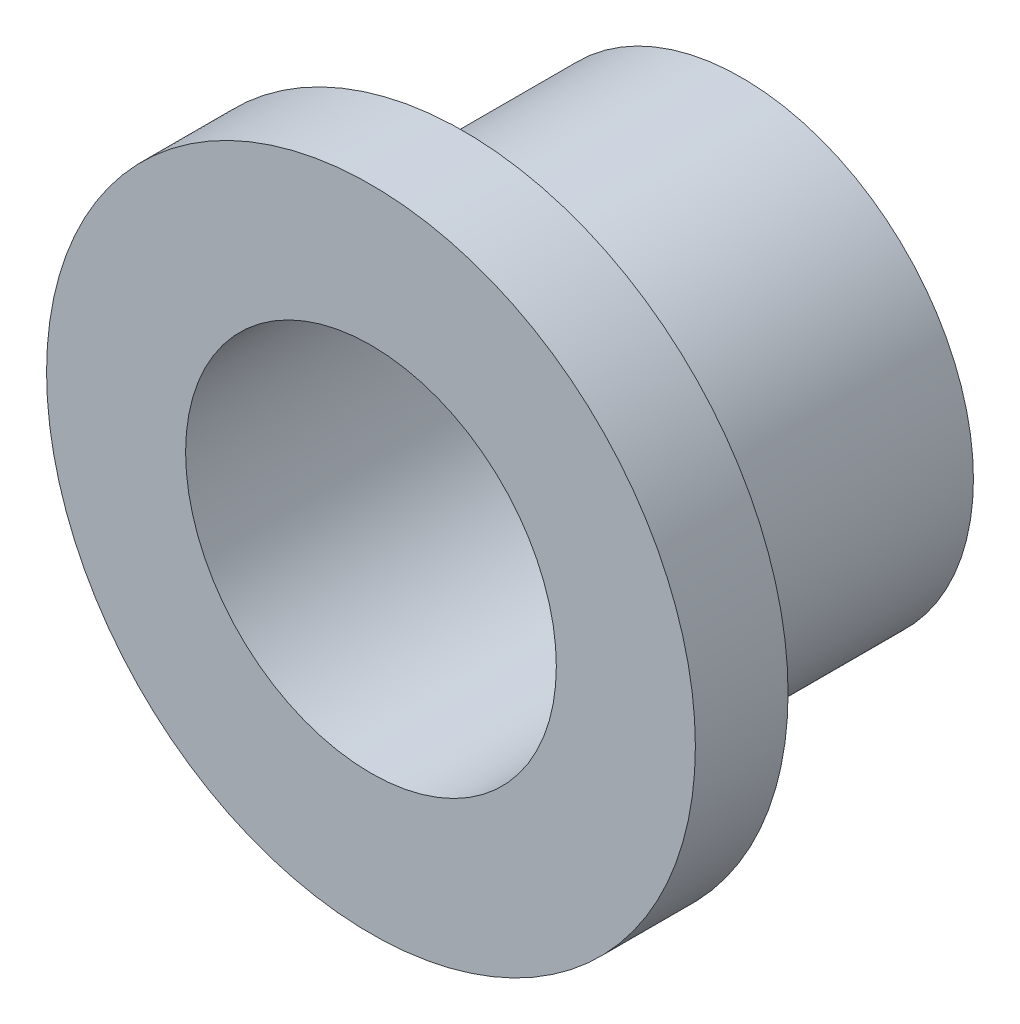
ISO-10303-21;
HEADER;
FILE_DESCRIPTION(('STEP AP214'),'2;1');
FILE_NAME('part.step','',(''),(''),'','','');
FILE_SCHEMA(('AUTOMOTIVE_DESIGN { 1 0 10303 214 1 1 1 1 }'));
ENDSEC;
DATA;
#1=APPLICATION_CONTEXT('core data for automotive mechanical design processes');
#2=APPLICATION_PROTOCOL_DEFINITION('international standard','automotive_design',2000,#1);
#3=PRODUCT_CONTEXT('',#1,'mechanical');
#4=PRODUCT('Part','Part','',(#3));
#5=PRODUCT_RELATED_PRODUCT_CATEGORY('part','',(#4));
#6=PRODUCT_DEFINITION_FORMATION('','',#4);
#7=PRODUCT_DEFINITION_CONTEXT('part definition',#1,'design');
#8=PRODUCT_DEFINITION('design','',#6,#7);
#9=PRODUCT_DEFINITION_SHAPE('','',#8);
#10=(LENGTH_UNIT() NAMED_UNIT(*) SI_UNIT(.MILLI.,.METRE.));
#11=(NAMED_UNIT(*) PLANE_ANGLE_UNIT() SI_UNIT($,.RADIAN.));
#12=(NAMED_UNIT(*) SI_UNIT($,.STERADIAN.) SOLID_ANGLE_UNIT());
#13=UNCERTAINTY_MEASURE_WITH_UNIT(LENGTH_MEASURE(1.E-05),#10,'distance_accuracy_value','');
#14=(GEOMETRIC_REPRESENTATION_CONTEXT(3) GLOBAL_UNCERTAINTY_ASSIGNED_CONTEXT((#13)) GLOBAL_UNIT_ASSIGNED_CONTEXT((#10,
#11,#12)) REPRESENTATION_CONTEXT('',''));
#15=CARTESIAN_POINT('',(0.,0.,0.));
#16=DIRECTION('',(0.,0.,1.));
#17=DIRECTION('',(1.,0.,0.));
#18=AXIS2_PLACEMENT_3D('',#15,#16,#17);
#19=CARTESIAN_POINT('',(0.,0.,0.));
#20=DIRECTION('',(0.,0.,1.));
#21=DIRECTION('',(1.,0.,0.));
#22=AXIS2_PLACEMENT_3D('',#19,#20,#21);
#23=CYLINDRICAL_SURFACE('',#22,11.1125);
#24=CARTESIAN_POINT('',(0.,0.,0.));
#25=DIRECTION('',(0.,0.,1.));
#26=DIRECTION('',(1.,0.,0.));
#27=AXIS2_PLACEMENT_3D('',#24,#25,#26);
#28=CIRCLE('',#27,11.1125);
#29=CARTESIAN_POINT('',(11.1125,0.,0.));
#30=VERTEX_POINT('',#29);
#31=EDGE_CURVE('E53',#30,#30,#28,.T.);
#32=ORIENTED_EDGE('',*,*,#31,.F.);
#33=EDGE_LOOP('',(#32));
#34=FACE_BOUND('',#33,.T.);
#35=CARTESIAN_POINT('',(0.,0.,-3.175));
#36=DIRECTION('',(0.,0.,1.));
#37=DIRECTION('',(1.,0.,0.));
#38=AXIS2_PLACEMENT_3D('',#35,#36,#37);
#39=CIRCLE('',#38,11.1125);
#40=CARTESIAN_POINT('',(11.1125,0.,-3.175));
#41=VERTEX_POINT('',#40);
#42=EDGE_CURVE('E10',#41,#41,#39,.T.);
#43=ORIENTED_EDGE('',*,*,#42,.T.);
#44=EDGE_LOOP('',(#43));
#45=FACE_BOUND('',#44,.T.);
#46=ADVANCED_FACE('F31',(#34,#45),#23,.T.);
#47=CARTESIAN_POINT('',(0.,11.1125,-3.175));
#48=DIRECTION('',(0.,0.,1.));
#49=DIRECTION('',(1.,0.,0.));
#50=AXIS2_PLACEMENT_3D('',#47,#48,#49);
#51=PLANE('',#50);
#52=ORIENTED_EDGE('',*,*,#42,.F.);
#53=EDGE_LOOP('',(#52));
#54=FACE_BOUND('',#53,.T.);
#55=CARTESIAN_POINT('',(0.,0.,-3.175));
#56=DIRECTION('',(0.,0.,1.));
#57=DIRECTION('',(1.,0.,0.));
#58=AXIS2_PLACEMENT_3D('',#55,#56,#57);
#59=CIRCLE('',#58,7.9375);
#60=CARTESIAN_POINT('',(7.9375,0.,-3.175));
#61=VERTEX_POINT('',#60);
#62=EDGE_CURVE('E37',#61,#61,#59,.T.);
#63=ORIENTED_EDGE('',*,*,#62,.T.);
#64=EDGE_LOOP('',(#63));
#65=FACE_BOUND('',#64,.T.);
#66=ADVANCED_FACE('F60',(#54,#65),#51,.F.);
#67=CARTESIAN_POINT('',(0.,0.,0.));
#68=DIRECTION('',(0.,0.,1.));
#69=DIRECTION('',(1.,0.,0.));
#70=AXIS2_PLACEMENT_3D('',#67,#68,#69);
#71=CYLINDRICAL_SURFACE('',#70,7.9375);
#72=ORIENTED_EDGE('',*,*,#62,.F.);
#73=EDGE_LOOP('',(#72));
#74=FACE_BOUND('',#73,.T.);
#75=CARTESIAN_POINT('',(0.,0.,-12.7));
#76=DIRECTION('',(0.,0.,1.));
#77=DIRECTION('',(1.,0.,0.));
#78=AXIS2_PLACEMENT_3D('',#75,#76,#77);
#79=CIRCLE('',#78,7.9375);
#80=CARTESIAN_POINT('',(7.9375,0.,-12.7));
#81=VERTEX_POINT('',#80);
#82=EDGE_CURVE('E41',#81,#81,#79,.T.);
#83=ORIENTED_EDGE('',*,*,#82,.T.);
#84=EDGE_LOOP('',(#83));
#85=FACE_BOUND('',#84,.T.);
#86=ADVANCED_FACE('F64',(#74,#85),#71,.T.);
#87=CARTESIAN_POINT('',(0.,7.9375,-12.7));
#88=DIRECTION('',(0.,0.,1.));
#89=DIRECTION('',(1.,0.,0.));
#90=AXIS2_PLACEMENT_3D('',#87,#88,#89);
#91=PLANE('',#90);
#92=ORIENTED_EDGE('',*,*,#82,.F.);
#93=EDGE_LOOP('',(#92));
#94=FACE_BOUND('',#93,.T.);
#95=CARTESIAN_POINT('',(0.,0.,-12.7));
#96=DIRECTION('',(0.,0.,1.));
#97=DIRECTION('',(1.,0.,0.));
#98=AXIS2_PLACEMENT_3D('',#95,#96,#97);
#99=CIRCLE('',#98,6.35);
#100=CARTESIAN_POINT('',(6.35,0.,-12.7));
#101=VERTEX_POINT('',#100);
#102=EDGE_CURVE('E45',#101,#101,#99,.T.);
#103=ORIENTED_EDGE('',*,*,#102,.T.);
#104=EDGE_LOOP('',(#103));
#105=FACE_BOUND('',#104,.T.);
#106=ADVANCED_FACE('F69',(#94,#105),#91,.F.);
#107=CARTESIAN_POINT('',(0.,0.,0.));
#108=DIRECTION('',(0.,0.,1.));
#109=DIRECTION('',(1.,0.,0.));
#110=AXIS2_PLACEMENT_3D('',#107,#108,#109);
#111=CYLINDRICAL_SURFACE('',#110,6.35);
#112=ORIENTED_EDGE('',*,*,#102,.F.);
#113=EDGE_LOOP('',(#112));
#114=FACE_BOUND('',#113,.T.);
#115=CARTESIAN_POINT('',(0.,0.,0.));
#116=DIRECTION('',(0.,0.,1.));
#117=DIRECTION('',(1.,0.,0.));
#118=AXIS2_PLACEMENT_3D('',#115,#116,#117);
#119=CIRCLE('',#118,6.34999999999999);
#120=CARTESIAN_POINT('',(6.34999999999999,0.,0.));
#121=VERTEX_POINT('',#120);
#122=EDGE_CURVE('E50',#121,#121,#119,.T.);
#123=ORIENTED_EDGE('',*,*,#122,.T.);
#124=EDGE_LOOP('',(#123));
#125=FACE_BOUND('',#124,.T.);
#126=ADVANCED_FACE('F75',(#114,#125),#111,.F.);
#127=CARTESIAN_POINT('',(0.,6.34999999999999,0.));
#128=DIRECTION('',(0.,0.,-1.));
#129=DIRECTION('',(-1.,0.,0.));
#130=AXIS2_PLACEMENT_3D('',#127,#128,#129);
#131=PLANE('',#130);
#132=ORIENTED_EDGE('',*,*,#122,.F.);
#133=EDGE_LOOP('',(#132));
#134=FACE_BOUND('',#133,.T.);
#135=ORIENTED_EDGE('',*,*,#31,.T.);
#136=EDGE_LOOP('',(#135));
#137=FACE_BOUND('',#136,.T.);
#138=ADVANCED_FACE('F57',(#134,#137),#131,.F.);
#139=CLOSED_SHELL('',(#46,#66,#86,#106,#126,#138));
#140=MANIFOLD_SOLID_BREP('B2',#139);
#141=ADVANCED_BREP_SHAPE_REPRESENTATION('',(#18,#140),#14);
#142=SHAPE_DEFINITION_REPRESENTATION(#9,#141);
ENDSEC;
END-ISO-10303-21;
